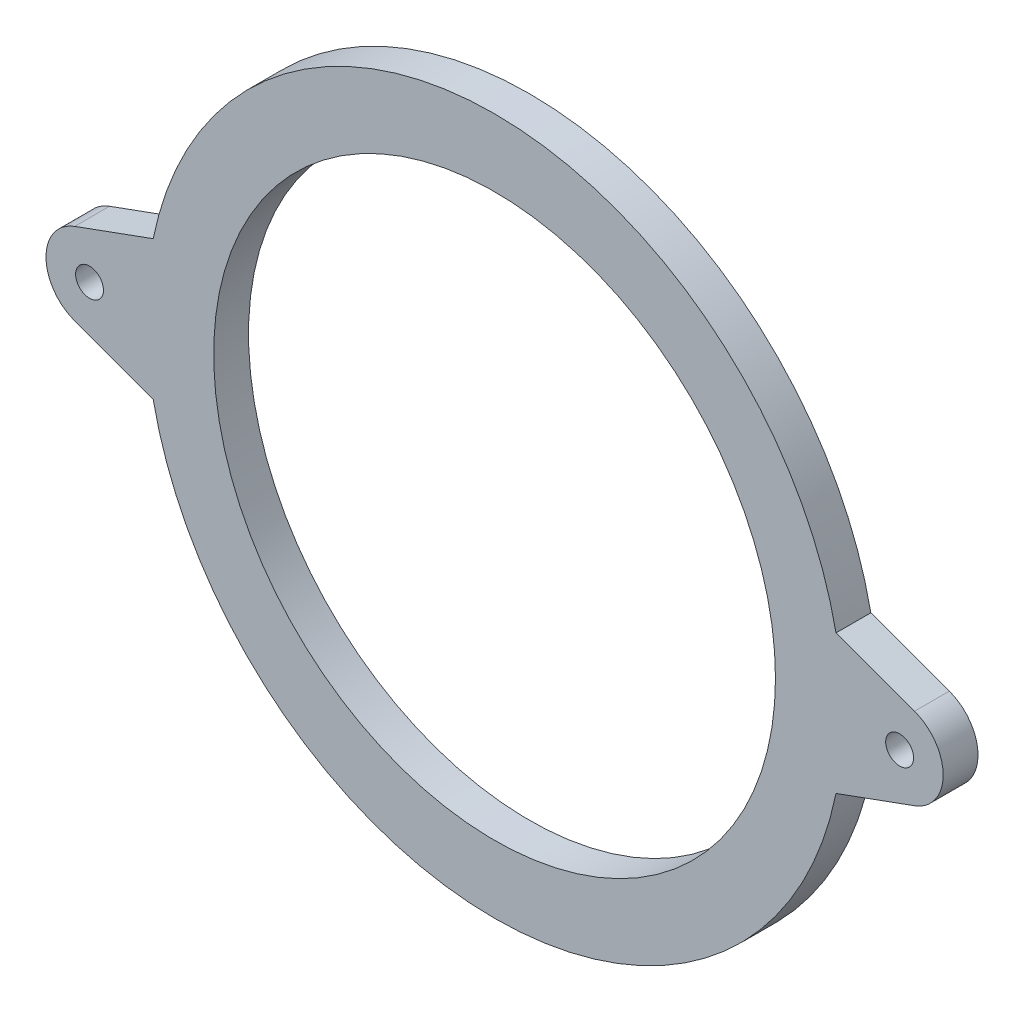
ISO-10303-21;
HEADER;
FILE_DESCRIPTION(('STEP AP214'),'2;1');
FILE_NAME('part.step','',(''),(''),'','','');
FILE_SCHEMA(('AUTOMOTIVE_DESIGN { 1 0 10303 214 1 1 1 1 }'));
ENDSEC;
DATA;
#1=APPLICATION_CONTEXT('core data for automotive mechanical design processes');
#2=APPLICATION_PROTOCOL_DEFINITION('international standard','automotive_design',2000,#1);
#3=PRODUCT_CONTEXT('',#1,'mechanical');
#4=PRODUCT('Part','Part','',(#3));
#5=PRODUCT_RELATED_PRODUCT_CATEGORY('part','',(#4));
#6=PRODUCT_DEFINITION_FORMATION('','',#4);
#7=PRODUCT_DEFINITION_CONTEXT('part definition',#1,'design');
#8=PRODUCT_DEFINITION('design','',#6,#7);
#9=PRODUCT_DEFINITION_SHAPE('','',#8);
#10=(LENGTH_UNIT() NAMED_UNIT(*) SI_UNIT(.MILLI.,.METRE.));
#11=(NAMED_UNIT(*) PLANE_ANGLE_UNIT() SI_UNIT($,.RADIAN.));
#12=(NAMED_UNIT(*) SI_UNIT($,.STERADIAN.) SOLID_ANGLE_UNIT());
#13=UNCERTAINTY_MEASURE_WITH_UNIT(LENGTH_MEASURE(1.E-05),#10,'distance_accuracy_value','');
#14=(GEOMETRIC_REPRESENTATION_CONTEXT(3) GLOBAL_UNCERTAINTY_ASSIGNED_CONTEXT((#13)) GLOBAL_UNIT_ASSIGNED_CONTEXT((#10,
#11,#12)) REPRESENTATION_CONTEXT('',''));
#15=CARTESIAN_POINT('',(0.,0.,0.));
#16=DIRECTION('',(0.,0.,1.));
#17=DIRECTION('',(1.,0.,0.));
#18=AXIS2_PLACEMENT_3D('',#15,#16,#17);
#19=CARTESIAN_POINT('',(0.,0.,4.));
#20=DIRECTION('',(0.,0.,-1.));
#21=DIRECTION('',(-1.,0.,0.));
#22=AXIS2_PLACEMENT_3D('',#19,#20,#21);
#23=CYLINDRICAL_SURFACE('',#22,40.);
#24=CARTESIAN_POINT('',(0.,0.,0.));
#25=DIRECTION('',(0.,0.,1.));
#26=DIRECTION('',(1.,0.,0.));
#27=AXIS2_PLACEMENT_3D('',#24,#25,#26);
#28=CIRCLE('',#27,40.);
#29=CARTESIAN_POINT('',(-39.1960539707486,-7.9793078097138,0.));
#30=VERTEX_POINT('',#29);
#31=CARTESIAN_POINT('',(39.1960539707486,-7.9793078097138,0.));
#32=VERTEX_POINT('',#31);
#33=EDGE_CURVE('E42',#30,#32,#28,.T.);
#34=ORIENTED_EDGE('',*,*,#33,.T.);
#35=DIRECTION('',(0.,0.,-1.));
#36=VECTOR('',#35,1.);
#37=CARTESIAN_POINT('',(39.1960539707486,-7.9793078097138,24.1510421660858));
#38=LINE('',#37,#36);
#39=CARTESIAN_POINT('',(39.1960539707486,-7.9793078097138,4.));
#40=VERTEX_POINT('',#39);
#41=EDGE_CURVE('E114',#40,#32,#38,.T.);
#42=ORIENTED_EDGE('',*,*,#41,.F.);
#43=CARTESIAN_POINT('',(0.,0.,4.));
#44=DIRECTION('',(0.,0.,1.));
#45=DIRECTION('',(1.,0.,0.));
#46=AXIS2_PLACEMENT_3D('',#43,#44,#45);
#47=CIRCLE('',#46,40.);
#48=CARTESIAN_POINT('',(-39.1960539707486,-7.9793078097138,4.));
#49=VERTEX_POINT('',#48);
#50=EDGE_CURVE('E11',#49,#40,#47,.T.);
#51=ORIENTED_EDGE('',*,*,#50,.F.);
#52=DIRECTION('',(0.,0.,-1.));
#53=VECTOR('',#52,1.);
#54=CARTESIAN_POINT('',(-39.1960539707486,-7.9793078097138,24.1510421660858));
#55=LINE('',#54,#53);
#56=EDGE_CURVE('E62',#49,#30,#55,.T.);
#57=ORIENTED_EDGE('',*,*,#56,.T.);
#58=EDGE_LOOP('',(#34,#42,#51,#57));
#59=FACE_BOUND('',#58,.T.);
#60=ADVANCED_FACE('F38',(#59),#23,.T.);
#61=CARTESIAN_POINT('',(0.,0.,4.));
#62=DIRECTION('',(0.,0.,1.));
#63=DIRECTION('',(1.,0.,0.));
#64=AXIS2_PLACEMENT_3D('',#61,#62,#63);
#65=PLANE('',#64);
#66=ORIENTED_EDGE('',*,*,#50,.T.);
#67=DIRECTION('',(-0.939692620785911,-0.342020143325663,0.));
#68=VECTOR('',#67,1.);
#69=CARTESIAN_POINT('',(48.2101007166283,-4.69846310392954,4.));
#70=LINE('',#69,#68);
#71=CARTESIAN_POINT('',(48.2101007166283,-4.69846310392954,4.));
#72=VERTEX_POINT('',#71);
#73=EDGE_CURVE('E104',#72,#40,#70,.T.);
#74=ORIENTED_EDGE('',*,*,#73,.F.);
#75=CARTESIAN_POINT('',(46.5,0.,4.));
#76=DIRECTION('',(0.,0.,1.));
#77=DIRECTION('',(1.,0.,0.));
#78=AXIS2_PLACEMENT_3D('',#75,#76,#77);
#79=CIRCLE('',#78,4.99999999999998);
#80=CARTESIAN_POINT('',(48.2101007166283,4.69846310392953,4.));
#81=VERTEX_POINT('',#80);
#82=EDGE_CURVE('E109',#81,#72,#79,.F.);
#83=ORIENTED_EDGE('',*,*,#82,.F.);
#84=DIRECTION('',(0.939692620785911,-0.342020143325663,0.));
#85=VECTOR('',#84,1.);
#86=CARTESIAN_POINT('',(48.2101007166283,4.69846310392954,4.));
#87=LINE('',#86,#85);
#88=CARTESIAN_POINT('',(39.1960539707486,7.9793078097138,4.));
#89=VERTEX_POINT('',#88);
#90=EDGE_CURVE('E124',#89,#81,#87,.T.);
#91=ORIENTED_EDGE('',*,*,#90,.F.);
#92=CARTESIAN_POINT('',(-39.1960539707486,7.9793078097138,4.));
#93=VERTEX_POINT('',#92);
#94=EDGE_CURVE('E47',#89,#93,#47,.T.);
#95=ORIENTED_EDGE('',*,*,#94,.T.);
#96=DIRECTION('',(0.939692620785911,0.342020143325663,0.));
#97=VECTOR('',#96,1.);
#98=CARTESIAN_POINT('',(-48.2101007166283,4.69846310392954,4.));
#99=LINE('',#98,#97);
#100=CARTESIAN_POINT('',(-48.2101007166283,4.69846310392954,4.));
#101=VERTEX_POINT('',#100);
#102=EDGE_CURVE('E161',#101,#93,#99,.T.);
#103=ORIENTED_EDGE('',*,*,#102,.F.);
#104=CARTESIAN_POINT('',(-46.5,0.,4.));
#105=DIRECTION('',(0.,0.,1.));
#106=DIRECTION('',(1.,0.,0.));
#107=AXIS2_PLACEMENT_3D('',#104,#105,#106);
#108=CIRCLE('',#107,4.99999999999998);
#109=CARTESIAN_POINT('',(-48.2101007166283,-4.69846310392954,4.));
#110=VERTEX_POINT('',#109);
#111=EDGE_CURVE('E164',#110,#101,#108,.F.);
#112=ORIENTED_EDGE('',*,*,#111,.F.);
#113=DIRECTION('',(-0.939692620785911,0.342020143325663,0.));
#114=VECTOR('',#113,1.);
#115=CARTESIAN_POINT('',(-48.2101007166283,-4.69846310392954,4.));
#116=LINE('',#115,#114);
#117=EDGE_CURVE('E168',#49,#110,#116,.T.);
#118=ORIENTED_EDGE('',*,*,#117,.F.);
#119=EDGE_LOOP('',(#66,#74,#83,#91,#95,#103,#112,#118));
#120=FACE_BOUND('',#119,.T.);
#121=CARTESIAN_POINT('',(0.,0.,4.));
#122=DIRECTION('',(0.,0.,1.));
#123=DIRECTION('',(1.,0.,0.));
#124=AXIS2_PLACEMENT_3D('',#121,#122,#123);
#125=CIRCLE('',#124,32.25);
#126=CARTESIAN_POINT('',(32.25,0.,4.));
#127=VERTEX_POINT('',#126);
#128=EDGE_CURVE('E176',#127,#127,#125,.T.);
#129=ORIENTED_EDGE('',*,*,#128,.F.);
#130=EDGE_LOOP('',(#129));
#131=FACE_BOUND('',#130,.T.);
#132=CARTESIAN_POINT('',(-46.5,0.,4.));
#133=DIRECTION('',(0.,0.,1.));
#134=DIRECTION('',(1.,0.,0.));
#135=AXIS2_PLACEMENT_3D('',#132,#133,#134);
#136=CIRCLE('',#135,1.6);
#137=CARTESIAN_POINT('',(-44.9,0.,4.));
#138=VERTEX_POINT('',#137);
#139=EDGE_CURVE('E147',#138,#138,#136,.F.);
#140=ORIENTED_EDGE('',*,*,#139,.T.);
#141=EDGE_LOOP('',(#140));
#142=FACE_BOUND('',#141,.T.);
#143=CARTESIAN_POINT('',(46.5,0.,4.));
#144=DIRECTION('',(0.,0.,1.));
#145=DIRECTION('',(1.,0.,0.));
#146=AXIS2_PLACEMENT_3D('',#143,#144,#145);
#147=CIRCLE('',#146,1.6);
#148=CARTESIAN_POINT('',(48.1,0.,4.));
#149=VERTEX_POINT('',#148);
#150=EDGE_CURVE('E132',#149,#149,#147,.F.);
#151=ORIENTED_EDGE('',*,*,#150,.T.);
#152=EDGE_LOOP('',(#151));
#153=FACE_BOUND('',#152,.T.);
#154=ADVANCED_FACE('F106',(#120,#131,#142,#153),#65,.T.);
#155=CARTESIAN_POINT('',(0.,0.,0.));
#156=DIRECTION('',(0.,0.,1.));
#157=DIRECTION('',(1.,0.,0.));
#158=AXIS2_PLACEMENT_3D('',#155,#156,#157);
#159=PLANE('',#158);
#160=ORIENTED_EDGE('',*,*,#33,.F.);
#161=DIRECTION('',(-0.939692620785911,0.342020143325663,0.));
#162=VECTOR('',#161,1.);
#163=CARTESIAN_POINT('',(-48.2101007166283,-4.69846310392954,0.));
#164=LINE('',#163,#162);
#165=CARTESIAN_POINT('',(-48.2101007166283,-4.69846310392954,0.));
#166=VERTEX_POINT('',#165);
#167=EDGE_CURVE('E144',#30,#166,#164,.T.);
#168=ORIENTED_EDGE('',*,*,#167,.T.);
#169=CARTESIAN_POINT('',(-46.5,0.,0.));
#170=DIRECTION('',(0.,0.,-1.));
#171=DIRECTION('',(-1.,0.,0.));
#172=AXIS2_PLACEMENT_3D('',#169,#170,#171);
#173=CIRCLE('',#172,4.99999999999998);
#174=CARTESIAN_POINT('',(-48.2101007166283,4.69846310392954,0.));
#175=VERTEX_POINT('',#174);
#176=EDGE_CURVE('E151',#166,#175,#173,.T.);
#177=ORIENTED_EDGE('',*,*,#176,.T.);
#178=DIRECTION('',(0.939692620785911,0.342020143325663,0.));
#179=VECTOR('',#178,1.);
#180=CARTESIAN_POINT('',(-48.2101007166283,4.69846310392954,0.));
#181=LINE('',#180,#179);
#182=CARTESIAN_POINT('',(-39.1960539707486,7.9793078097138,0.));
#183=VERTEX_POINT('',#182);
#184=EDGE_CURVE('E148',#175,#183,#181,.T.);
#185=ORIENTED_EDGE('',*,*,#184,.T.);
#186=CARTESIAN_POINT('',(39.1960539707486,7.9793078097138,0.));
#187=VERTEX_POINT('',#186);
#188=EDGE_CURVE('E179',#187,#183,#28,.T.);
#189=ORIENTED_EDGE('',*,*,#188,.F.);
#190=DIRECTION('',(0.939692620785911,-0.342020143325663,0.));
#191=VECTOR('',#190,1.);
#192=CARTESIAN_POINT('',(48.2101007166283,4.69846310392954,0.));
#193=LINE('',#192,#191);
#194=CARTESIAN_POINT('',(48.2101007166283,4.69846310392953,0.));
#195=VERTEX_POINT('',#194);
#196=EDGE_CURVE('E138',#187,#195,#193,.T.);
#197=ORIENTED_EDGE('',*,*,#196,.T.);
#198=CARTESIAN_POINT('',(46.5,0.,0.));
#199=DIRECTION('',(0.,0.,-1.));
#200=DIRECTION('',(1.,0.,0.));
#201=AXIS2_PLACEMENT_3D('',#198,#199,#200);
#202=CIRCLE('',#201,4.99999999999998);
#203=CARTESIAN_POINT('',(48.2101007166283,-4.69846310392954,0.));
#204=VERTEX_POINT('',#203);
#205=EDGE_CURVE('E141',#195,#204,#202,.T.);
#206=ORIENTED_EDGE('',*,*,#205,.T.);
#207=DIRECTION('',(-0.939692620785911,-0.342020143325663,0.));
#208=VECTOR('',#207,1.);
#209=CARTESIAN_POINT('',(48.2101007166283,-4.69846310392954,0.));
#210=LINE('',#209,#208);
#211=EDGE_CURVE('E120',#204,#32,#210,.T.);
#212=ORIENTED_EDGE('',*,*,#211,.T.);
#213=EDGE_LOOP('',(#160,#168,#177,#185,#189,#197,#206,#212));
#214=FACE_BOUND('',#213,.T.);
#215=CARTESIAN_POINT('',(0.,0.,0.));
#216=DIRECTION('',(0.,0.,1.));
#217=DIRECTION('',(1.,0.,0.));
#218=AXIS2_PLACEMENT_3D('',#215,#216,#217);
#219=CIRCLE('',#218,32.25);
#220=CARTESIAN_POINT('',(32.25,0.,0.));
#221=VERTEX_POINT('',#220);
#222=EDGE_CURVE('E160',#221,#221,#219,.T.);
#223=ORIENTED_EDGE('',*,*,#222,.T.);
#224=EDGE_LOOP('',(#223));
#225=FACE_BOUND('',#224,.T.);
#226=CARTESIAN_POINT('',(-46.5,0.,0.));
#227=DIRECTION('',(0.,0.,-1.));
#228=DIRECTION('',(-1.,0.,0.));
#229=AXIS2_PLACEMENT_3D('',#226,#227,#228);
#230=CIRCLE('',#229,1.6);
#231=CARTESIAN_POINT('',(-48.1,0.,0.));
#232=VERTEX_POINT('',#231);
#233=EDGE_CURVE('E154',#232,#232,#230,.T.);
#234=ORIENTED_EDGE('',*,*,#233,.F.);
#235=EDGE_LOOP('',(#234));
#236=FACE_BOUND('',#235,.T.);
#237=CARTESIAN_POINT('',(46.5,0.,0.));
#238=DIRECTION('',(0.,0.,-1.));
#239=DIRECTION('',(1.,0.,0.));
#240=AXIS2_PLACEMENT_3D('',#237,#238,#239);
#241=CIRCLE('',#240,1.6);
#242=CARTESIAN_POINT('',(48.1,0.,0.));
#243=VERTEX_POINT('',#242);
#244=EDGE_CURVE('E135',#243,#243,#241,.T.);
#245=ORIENTED_EDGE('',*,*,#244,.F.);
#246=EDGE_LOOP('',(#245));
#247=FACE_BOUND('',#246,.T.);
#248=ADVANCED_FACE('F183',(#214,#225,#236,#247),#159,.F.);
#249=ORIENTED_EDGE('',*,*,#94,.F.);
#250=DIRECTION('',(0.,0.,-1.));
#251=VECTOR('',#250,1.);
#252=CARTESIAN_POINT('',(39.1960539707486,7.9793078097138,24.1510421660858));
#253=LINE('',#252,#251);
#254=EDGE_CURVE('E54',#89,#187,#253,.T.);
#255=ORIENTED_EDGE('',*,*,#254,.T.);
#256=ORIENTED_EDGE('',*,*,#188,.T.);
#257=DIRECTION('',(0.,0.,-1.));
#258=VECTOR('',#257,1.);
#259=CARTESIAN_POINT('',(-39.1960539707486,7.9793078097138,24.1510421660858));
#260=LINE('',#259,#258);
#261=EDGE_CURVE('E157',#93,#183,#260,.T.);
#262=ORIENTED_EDGE('',*,*,#261,.F.);
#263=EDGE_LOOP('',(#249,#255,#256,#262));
#264=FACE_BOUND('',#263,.T.);
#265=ADVANCED_FACE('F40',(#264),#23,.T.);
#266=CARTESIAN_POINT('',(0.,0.,4.));
#267=DIRECTION('',(0.,0.,-1.));
#268=DIRECTION('',(-1.,0.,0.));
#269=AXIS2_PLACEMENT_3D('',#266,#267,#268);
#270=CYLINDRICAL_SURFACE('',#269,32.25);
#271=ORIENTED_EDGE('',*,*,#128,.T.);
#272=EDGE_LOOP('',(#271));
#273=FACE_BOUND('',#272,.T.);
#274=ORIENTED_EDGE('',*,*,#222,.F.);
#275=EDGE_LOOP('',(#274));
#276=FACE_BOUND('',#275,.T.);
#277=ADVANCED_FACE('F186',(#273,#276),#270,.F.);
#278=CARTESIAN_POINT('',(-46.5,0.,24.1510421660858));
#279=DIRECTION('',(0.,0.,-1.));
#280=DIRECTION('',(-1.,0.,0.));
#281=AXIS2_PLACEMENT_3D('',#278,#279,#280);
#282=CYLINDRICAL_SURFACE('',#281,4.99999999999998);
#283=DIRECTION('',(0.,0.,-1.));
#284=VECTOR('',#283,1.);
#285=CARTESIAN_POINT('',(-48.2101007166283,-4.69846310392954,24.1510421660858));
#286=LINE('',#285,#284);
#287=EDGE_CURVE('E170',#110,#166,#286,.T.);
#288=ORIENTED_EDGE('',*,*,#287,.F.);
#289=ORIENTED_EDGE('',*,*,#111,.T.);
#290=DIRECTION('',(0.,0.,-1.));
#291=VECTOR('',#290,1.);
#292=CARTESIAN_POINT('',(-48.2101007166283,4.69846310392954,24.1510421660858));
#293=LINE('',#292,#291);
#294=EDGE_CURVE('E167',#101,#175,#293,.T.);
#295=ORIENTED_EDGE('',*,*,#294,.T.);
#296=ORIENTED_EDGE('',*,*,#176,.F.);
#297=EDGE_LOOP('',(#288,#289,#295,#296));
#298=FACE_BOUND('',#297,.T.);
#299=ADVANCED_FACE('F188',(#298),#282,.T.);
#300=CARTESIAN_POINT('',(-48.2101007166283,-4.69846310392954,24.1510421660858));
#301=DIRECTION('',(-0.342020143325663,-0.939692620785911,0.));
#302=DIRECTION('',(0.939692620785911,-0.342020143325663,0.));
#303=AXIS2_PLACEMENT_3D('',#300,#301,#302);
#304=PLANE('',#303);
#305=ORIENTED_EDGE('',*,*,#56,.F.);
#306=ORIENTED_EDGE('',*,*,#117,.T.);
#307=ORIENTED_EDGE('',*,*,#287,.T.);
#308=ORIENTED_EDGE('',*,*,#167,.F.);
#309=EDGE_LOOP('',(#305,#306,#307,#308));
#310=FACE_BOUND('',#309,.T.);
#311=ADVANCED_FACE('F195',(#310),#304,.T.);
#312=CARTESIAN_POINT('',(-48.2101007166283,4.69846310392954,24.1510421660858));
#313=DIRECTION('',(-0.342020143325663,0.939692620785911,0.));
#314=DIRECTION('',(-0.939692620785911,-0.342020143325663,0.));
#315=AXIS2_PLACEMENT_3D('',#312,#313,#314);
#316=PLANE('',#315);
#317=ORIENTED_EDGE('',*,*,#294,.F.);
#318=ORIENTED_EDGE('',*,*,#102,.T.);
#319=ORIENTED_EDGE('',*,*,#261,.T.);
#320=ORIENTED_EDGE('',*,*,#184,.F.);
#321=EDGE_LOOP('',(#317,#318,#319,#320));
#322=FACE_BOUND('',#321,.T.);
#323=ADVANCED_FACE('F215',(#322),#316,.T.);
#324=CARTESIAN_POINT('',(-46.5,0.,24.1510421660858));
#325=DIRECTION('',(0.,0.,-1.));
#326=DIRECTION('',(-1.,0.,0.));
#327=AXIS2_PLACEMENT_3D('',#324,#325,#326);
#328=CYLINDRICAL_SURFACE('',#327,1.6);
#329=ORIENTED_EDGE('',*,*,#233,.T.);
#330=EDGE_LOOP('',(#329));
#331=FACE_BOUND('',#330,.T.);
#332=ORIENTED_EDGE('',*,*,#139,.F.);
#333=EDGE_LOOP('',(#332));
#334=FACE_BOUND('',#333,.T.);
#335=ADVANCED_FACE('F235',(#331,#334),#328,.F.);
#336=CARTESIAN_POINT('',(48.2101007166283,-4.69846310392954,24.1510421660858));
#337=DIRECTION('',(0.342020143325663,-0.939692620785911,0.));
#338=DIRECTION('',(0.939692620785911,0.342020143325663,0.));
#339=AXIS2_PLACEMENT_3D('',#336,#337,#338);
#340=PLANE('',#339);
#341=DIRECTION('',(0.,0.,-1.));
#342=VECTOR('',#341,1.);
#343=CARTESIAN_POINT('',(48.2101007166283,-4.69846310392954,24.1510421660858));
#344=LINE('',#343,#342);
#345=EDGE_CURVE('E117',#72,#204,#344,.T.);
#346=ORIENTED_EDGE('',*,*,#345,.F.);
#347=ORIENTED_EDGE('',*,*,#73,.T.);
#348=ORIENTED_EDGE('',*,*,#41,.T.);
#349=ORIENTED_EDGE('',*,*,#211,.F.);
#350=EDGE_LOOP('',(#346,#347,#348,#349));
#351=FACE_BOUND('',#350,.T.);
#352=ADVANCED_FACE('F118',(#351),#340,.T.);
#353=CARTESIAN_POINT('',(46.5,0.,24.1510421660858));
#354=DIRECTION('',(0.,0.,-1.));
#355=DIRECTION('',(-1.,0.,0.));
#356=AXIS2_PLACEMENT_3D('',#353,#354,#355);
#357=CYLINDRICAL_SURFACE('',#356,4.99999999999998);
#358=DIRECTION('',(0.,0.,-1.));
#359=VECTOR('',#358,1.);
#360=CARTESIAN_POINT('',(48.2101007166283,4.69846310392953,24.1510421660858));
#361=LINE('',#360,#359);
#362=EDGE_CURVE('E127',#81,#195,#361,.T.);
#363=ORIENTED_EDGE('',*,*,#362,.F.);
#364=ORIENTED_EDGE('',*,*,#82,.T.);
#365=ORIENTED_EDGE('',*,*,#345,.T.);
#366=ORIENTED_EDGE('',*,*,#205,.F.);
#367=EDGE_LOOP('',(#363,#364,#365,#366));
#368=FACE_BOUND('',#367,.T.);
#369=ADVANCED_FACE('F126',(#368),#357,.T.);
#370=CARTESIAN_POINT('',(48.2101007166283,4.69846310392954,24.1510421660858));
#371=DIRECTION('',(0.342020143325663,0.939692620785911,0.));
#372=DIRECTION('',(-0.939692620785911,0.342020143325663,0.));
#373=AXIS2_PLACEMENT_3D('',#370,#371,#372);
#374=PLANE('',#373);
#375=ORIENTED_EDGE('',*,*,#254,.F.);
#376=ORIENTED_EDGE('',*,*,#90,.T.);
#377=ORIENTED_EDGE('',*,*,#362,.T.);
#378=ORIENTED_EDGE('',*,*,#196,.F.);
#379=EDGE_LOOP('',(#375,#376,#377,#378));
#380=FACE_BOUND('',#379,.T.);
#381=ADVANCED_FACE('F218',(#380),#374,.T.);
#382=CARTESIAN_POINT('',(46.5,0.,24.1510421660858));
#383=DIRECTION('',(0.,0.,-1.));
#384=DIRECTION('',(-1.,0.,0.));
#385=AXIS2_PLACEMENT_3D('',#382,#383,#384);
#386=CYLINDRICAL_SURFACE('',#385,1.6);
#387=ORIENTED_EDGE('',*,*,#244,.T.);
#388=EDGE_LOOP('',(#387));
#389=FACE_BOUND('',#388,.T.);
#390=ORIENTED_EDGE('',*,*,#150,.F.);
#391=EDGE_LOOP('',(#390));
#392=FACE_BOUND('',#391,.T.);
#393=ADVANCED_FACE('F222',(#389,#392),#386,.F.);
#394=CLOSED_SHELL('',(#60,#154,#248,#265,#277,#299,#311,#323,#335,#352,#369,#381,#393));
#395=MANIFOLD_SOLID_BREP('B2',#394);
#396=ADVANCED_BREP_SHAPE_REPRESENTATION('',(#18,#395),#14);
#397=SHAPE_DEFINITION_REPRESENTATION(#9,#396);
ENDSEC;
END-ISO-10303-21;
